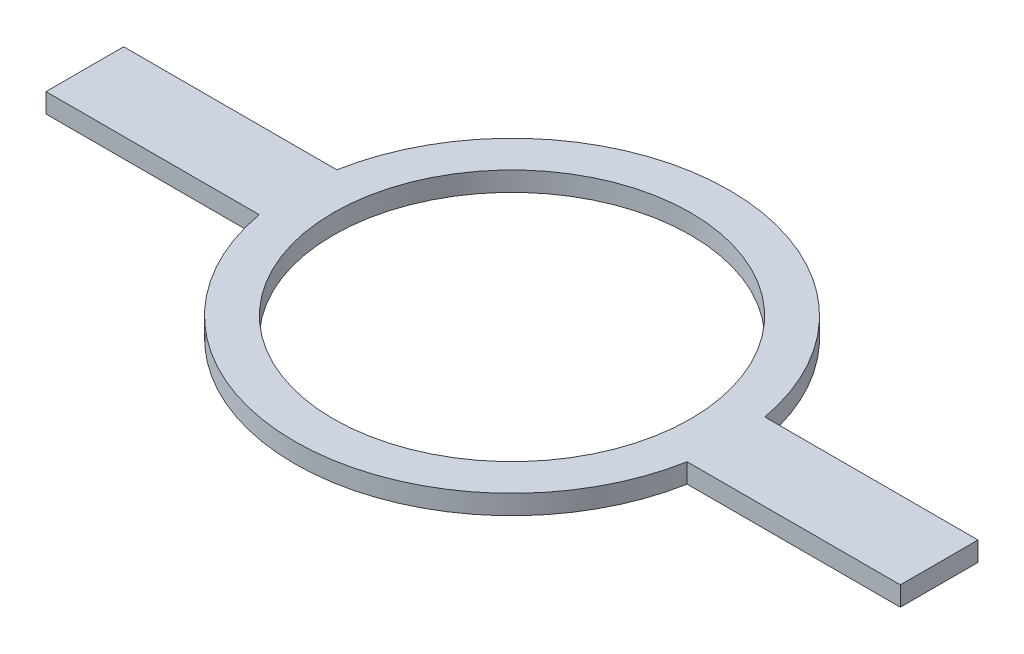
ISO-10303-21;
HEADER;
FILE_DESCRIPTION(('STEP AP214'),'2;1');
FILE_NAME('part.step','',(''),(''),'','','');
FILE_SCHEMA(('AUTOMOTIVE_DESIGN { 1 0 10303 214 1 1 1 1 }'));
ENDSEC;
DATA;
#1=APPLICATION_CONTEXT('core data for automotive mechanical design processes');
#2=APPLICATION_PROTOCOL_DEFINITION('international standard','automotive_design',2000,#1);
#3=PRODUCT_CONTEXT('',#1,'mechanical');
#4=PRODUCT('Part','Part','',(#3));
#5=PRODUCT_RELATED_PRODUCT_CATEGORY('part','',(#4));
#6=PRODUCT_DEFINITION_FORMATION('','',#4);
#7=PRODUCT_DEFINITION_CONTEXT('part definition',#1,'design');
#8=PRODUCT_DEFINITION('design','',#6,#7);
#9=PRODUCT_DEFINITION_SHAPE('','',#8);
#10=(LENGTH_UNIT() NAMED_UNIT(*) SI_UNIT(.MILLI.,.METRE.));
#11=(NAMED_UNIT(*) PLANE_ANGLE_UNIT() SI_UNIT($,.RADIAN.));
#12=(NAMED_UNIT(*) SI_UNIT($,.STERADIAN.) SOLID_ANGLE_UNIT());
#13=UNCERTAINTY_MEASURE_WITH_UNIT(LENGTH_MEASURE(1.E-05),#10,'distance_accuracy_value','');
#14=(GEOMETRIC_REPRESENTATION_CONTEXT(3) GLOBAL_UNCERTAINTY_ASSIGNED_CONTEXT((#13)) GLOBAL_UNIT_ASSIGNED_CONTEXT((#10,
#11,#12)) REPRESENTATION_CONTEXT('',''));
#15=CARTESIAN_POINT('',(0.,0.,0.));
#16=DIRECTION('',(0.,0.,1.));
#17=DIRECTION('',(1.,0.,0.));
#18=AXIS2_PLACEMENT_3D('',#15,#16,#17);
#19=CARTESIAN_POINT('',(0.,6.35,0.));
#20=DIRECTION('',(0.,1.,0.));
#21=DIRECTION('',(0.,0.,1.));
#22=AXIS2_PLACEMENT_3D('',#19,#20,#21);
#23=PLANE('',#22);
#24=DIRECTION('',(1.,0.,0.));
#25=VECTOR('',#24,1.);
#26=CARTESIAN_POINT('',(69.976884754896,6.35,12.7));
#27=LINE('',#26,#25);
#28=CARTESIAN_POINT('',(69.976884754896,6.35,12.7));
#29=VERTEX_POINT('',#28);
#30=CARTESIAN_POINT('',(139.7,6.35,12.7));
#31=VERTEX_POINT('',#30);
#32=EDGE_CURVE('E143',#29,#31,#27,.T.);
#33=ORIENTED_EDGE('',*,*,#32,.T.);
#34=DIRECTION('',(0.,0.,-1.));
#35=VECTOR('',#34,1.);
#36=CARTESIAN_POINT('',(139.7,6.35,-12.7));
#37=LINE('',#36,#35);
#38=CARTESIAN_POINT('',(139.7,6.35,-12.7));
#39=VERTEX_POINT('',#38);
#40=EDGE_CURVE('E91',#31,#39,#37,.T.);
#41=ORIENTED_EDGE('',*,*,#40,.T.);
#42=DIRECTION('',(-1.,0.,0.));
#43=VECTOR('',#42,1.);
#44=CARTESIAN_POINT('',(69.976884754896,6.35,-12.7));
#45=LINE('',#44,#43);
#46=CARTESIAN_POINT('',(69.976884754896,6.35,-12.7));
#47=VERTEX_POINT('',#46);
#48=EDGE_CURVE('E158',#39,#47,#45,.T.);
#49=ORIENTED_EDGE('',*,*,#48,.T.);
#50=CARTESIAN_POINT('',(0.,6.35,0.));
#51=DIRECTION('',(0.,1.,0.));
#52=DIRECTION('',(0.,0.,1.));
#53=AXIS2_PLACEMENT_3D('',#50,#51,#52);
#54=CIRCLE('',#53,71.12);
#55=CARTESIAN_POINT('',(-69.976884754896,6.35,-12.7));
#56=VERTEX_POINT('',#55);
#57=EDGE_CURVE('E171',#47,#56,#54,.T.);
#58=ORIENTED_EDGE('',*,*,#57,.T.);
#59=DIRECTION('',(-1.,0.,0.));
#60=VECTOR('',#59,1.);
#61=CARTESIAN_POINT('',(-139.7,6.35,-12.7));
#62=LINE('',#61,#60);
#63=CARTESIAN_POINT('',(-139.7,6.35,-12.7));
#64=VERTEX_POINT('',#63);
#65=EDGE_CURVE('E110',#56,#64,#62,.T.);
#66=ORIENTED_EDGE('',*,*,#65,.T.);
#67=DIRECTION('',(0.,0.,1.));
#68=VECTOR('',#67,1.);
#69=CARTESIAN_POINT('',(-139.7,6.35,-12.7));
#70=LINE('',#69,#68);
#71=CARTESIAN_POINT('',(-139.7,6.35,12.7));
#72=VERTEX_POINT('',#71);
#73=EDGE_CURVE('E104',#64,#72,#70,.T.);
#74=ORIENTED_EDGE('',*,*,#73,.T.);
#75=DIRECTION('',(1.,0.,0.));
#76=VECTOR('',#75,1.);
#77=CARTESIAN_POINT('',(-139.7,6.35,12.7));
#78=LINE('',#77,#76);
#79=CARTESIAN_POINT('',(-69.976884754896,6.35,12.7));
#80=VERTEX_POINT('',#79);
#81=EDGE_CURVE('E108',#72,#80,#78,.T.);
#82=ORIENTED_EDGE('',*,*,#81,.T.);
#83=CARTESIAN_POINT('',(0.,6.35,0.));
#84=DIRECTION('',(0.,1.,0.));
#85=DIRECTION('',(0.,0.,1.));
#86=AXIS2_PLACEMENT_3D('',#83,#84,#85);
#87=CIRCLE('',#86,71.12);
#88=EDGE_CURVE('E48',#80,#29,#87,.T.);
#89=ORIENTED_EDGE('',*,*,#88,.T.);
#90=EDGE_LOOP('',(#33,#41,#49,#58,#66,#74,#82,#89));
#91=FACE_BOUND('',#90,.T.);
#92=CARTESIAN_POINT('',(0.,6.35,0.));
#93=DIRECTION('',(0.,1.,0.));
#94=DIRECTION('',(0.,0.,1.));
#95=AXIS2_PLACEMENT_3D('',#92,#93,#94);
#96=CIRCLE('',#95,58.42);
#97=CARTESIAN_POINT('',(0.,6.35,58.42));
#98=VERTEX_POINT('',#97);
#99=EDGE_CURVE('E132',#98,#98,#96,.T.);
#100=ORIENTED_EDGE('',*,*,#99,.F.);
#101=EDGE_LOOP('',(#100));
#102=FACE_BOUND('',#101,.T.);
#103=ADVANCED_FACE('F31',(#91,#102),#23,.T.);
#104=CARTESIAN_POINT('',(0.,0.,0.));
#105=DIRECTION('',(0.,1.,0.));
#106=DIRECTION('',(0.,0.,1.));
#107=AXIS2_PLACEMENT_3D('',#104,#105,#106);
#108=PLANE('',#107);
#109=DIRECTION('',(1.,0.,0.));
#110=VECTOR('',#109,1.);
#111=CARTESIAN_POINT('',(69.976884754896,0.,12.7));
#112=LINE('',#111,#110);
#113=CARTESIAN_POINT('',(69.976884754896,0.,12.7));
#114=VERTEX_POINT('',#113);
#115=CARTESIAN_POINT('',(139.7,0.,12.7));
#116=VERTEX_POINT('',#115);
#117=EDGE_CURVE('E128',#114,#116,#112,.T.);
#118=ORIENTED_EDGE('',*,*,#117,.F.);
#119=CARTESIAN_POINT('',(0.,0.,0.));
#120=DIRECTION('',(0.,1.,0.));
#121=DIRECTION('',(0.,0.,1.));
#122=AXIS2_PLACEMENT_3D('',#119,#120,#121);
#123=CIRCLE('',#122,71.12);
#124=CARTESIAN_POINT('',(-69.976884754896,0.,12.7));
#125=VERTEX_POINT('',#124);
#126=EDGE_CURVE('E83',#125,#114,#123,.T.);
#127=ORIENTED_EDGE('',*,*,#126,.F.);
#128=DIRECTION('',(1.,0.,0.));
#129=VECTOR('',#128,1.);
#130=CARTESIAN_POINT('',(-139.7,0.,12.7));
#131=LINE('',#130,#129);
#132=CARTESIAN_POINT('',(-139.7,0.,12.7));
#133=VERTEX_POINT('',#132);
#134=EDGE_CURVE('E77',#133,#125,#131,.T.);
#135=ORIENTED_EDGE('',*,*,#134,.F.);
#136=DIRECTION('',(0.,0.,1.));
#137=VECTOR('',#136,1.);
#138=CARTESIAN_POINT('',(-139.7,0.,-12.7));
#139=LINE('',#138,#137);
#140=CARTESIAN_POINT('',(-139.7,0.,-12.7));
#141=VERTEX_POINT('',#140);
#142=EDGE_CURVE('E118',#141,#133,#139,.T.);
#143=ORIENTED_EDGE('',*,*,#142,.F.);
#144=DIRECTION('',(-1.,0.,0.));
#145=VECTOR('',#144,1.);
#146=CARTESIAN_POINT('',(-139.7,0.,-12.7));
#147=LINE('',#146,#145);
#148=CARTESIAN_POINT('',(-69.976884754896,0.,-12.7));
#149=VERTEX_POINT('',#148);
#150=EDGE_CURVE('E138',#149,#141,#147,.T.);
#151=ORIENTED_EDGE('',*,*,#150,.F.);
#152=CARTESIAN_POINT('',(0.,0.,0.));
#153=DIRECTION('',(0.,1.,0.));
#154=DIRECTION('',(0.,0.,1.));
#155=AXIS2_PLACEMENT_3D('',#152,#153,#154);
#156=CIRCLE('',#155,71.12);
#157=CARTESIAN_POINT('',(69.976884754896,0.,-12.7));
#158=VERTEX_POINT('',#157);
#159=EDGE_CURVE('E136',#158,#149,#156,.T.);
#160=ORIENTED_EDGE('',*,*,#159,.F.);
#161=DIRECTION('',(-1.,0.,0.));
#162=VECTOR('',#161,1.);
#163=CARTESIAN_POINT('',(69.976884754896,0.,-12.7));
#164=LINE('',#163,#162);
#165=CARTESIAN_POINT('',(139.7,0.,-12.7));
#166=VERTEX_POINT('',#165);
#167=EDGE_CURVE('E134',#166,#158,#164,.T.);
#168=ORIENTED_EDGE('',*,*,#167,.F.);
#169=DIRECTION('',(0.,0.,-1.));
#170=VECTOR('',#169,1.);
#171=CARTESIAN_POINT('',(139.7,0.,-12.7));
#172=LINE('',#171,#170);
#173=EDGE_CURVE('E131',#116,#166,#172,.T.);
#174=ORIENTED_EDGE('',*,*,#173,.F.);
#175=EDGE_LOOP('',(#118,#127,#135,#143,#151,#160,#168,#174));
#176=FACE_BOUND('',#175,.T.);
#177=CARTESIAN_POINT('',(0.,0.,0.));
#178=DIRECTION('',(0.,1.,0.));
#179=DIRECTION('',(0.,0.,1.));
#180=AXIS2_PLACEMENT_3D('',#177,#178,#179);
#181=CIRCLE('',#180,58.42);
#182=CARTESIAN_POINT('',(0.,0.,58.42));
#183=VERTEX_POINT('',#182);
#184=EDGE_CURVE('E177',#183,#183,#181,.T.);
#185=ORIENTED_EDGE('',*,*,#184,.T.);
#186=EDGE_LOOP('',(#185));
#187=FACE_BOUND('',#186,.T.);
#188=ADVANCED_FACE('F162',(#176,#187),#108,.F.);
#189=CARTESIAN_POINT('',(69.976884754896,6.35,12.7));
#190=DIRECTION('',(0.,0.,-1.));
#191=DIRECTION('',(-1.,0.,0.));
#192=AXIS2_PLACEMENT_3D('',#189,#190,#191);
#193=PLANE('',#192);
#194=ORIENTED_EDGE('',*,*,#117,.T.);
#195=DIRECTION('',(0.,-1.,0.));
#196=VECTOR('',#195,1.);
#197=CARTESIAN_POINT('',(139.7,6.35,12.7));
#198=LINE('',#197,#196);
#199=EDGE_CURVE('E11',#31,#116,#198,.T.);
#200=ORIENTED_EDGE('',*,*,#199,.F.);
#201=ORIENTED_EDGE('',*,*,#32,.F.);
#202=DIRECTION('',(0.,-1.,0.));
#203=VECTOR('',#202,1.);
#204=CARTESIAN_POINT('',(69.976884754896,6.35,12.7));
#205=LINE('',#204,#203);
#206=EDGE_CURVE('E124',#29,#114,#205,.T.);
#207=ORIENTED_EDGE('',*,*,#206,.T.);
#208=EDGE_LOOP('',(#194,#200,#201,#207));
#209=FACE_BOUND('',#208,.T.);
#210=ADVANCED_FACE('F33',(#209),#193,.F.);
#211=CARTESIAN_POINT('',(139.7,6.35,-12.7));
#212=DIRECTION('',(-1.,0.,0.));
#213=DIRECTION('',(0.,0.,1.));
#214=AXIS2_PLACEMENT_3D('',#211,#212,#213);
#215=PLANE('',#214);
#216=ORIENTED_EDGE('',*,*,#173,.T.);
#217=DIRECTION('',(0.,-1.,0.));
#218=VECTOR('',#217,1.);
#219=CARTESIAN_POINT('',(139.7,6.35,-12.7));
#220=LINE('',#219,#218);
#221=EDGE_CURVE('E40',#39,#166,#220,.T.);
#222=ORIENTED_EDGE('',*,*,#221,.F.);
#223=ORIENTED_EDGE('',*,*,#40,.F.);
#224=ORIENTED_EDGE('',*,*,#199,.T.);
#225=EDGE_LOOP('',(#216,#222,#223,#224));
#226=FACE_BOUND('',#225,.T.);
#227=ADVANCED_FACE('F205',(#226),#215,.F.);
#228=CARTESIAN_POINT('',(69.976884754896,6.35,-12.7));
#229=DIRECTION('',(0.,0.,1.));
#230=DIRECTION('',(1.,0.,0.));
#231=AXIS2_PLACEMENT_3D('',#228,#229,#230);
#232=PLANE('',#231);
#233=ORIENTED_EDGE('',*,*,#167,.T.);
#234=DIRECTION('',(0.,-1.,0.));
#235=VECTOR('',#234,1.);
#236=CARTESIAN_POINT('',(69.976884754896,6.35,-12.7));
#237=LINE('',#236,#235);
#238=EDGE_CURVE('E150',#47,#158,#237,.T.);
#239=ORIENTED_EDGE('',*,*,#238,.F.);
#240=ORIENTED_EDGE('',*,*,#48,.F.);
#241=ORIENTED_EDGE('',*,*,#221,.T.);
#242=EDGE_LOOP('',(#233,#239,#240,#241));
#243=FACE_BOUND('',#242,.T.);
#244=ADVANCED_FACE('F156',(#243),#232,.F.);
#245=CARTESIAN_POINT('',(0.,6.35,0.));
#246=DIRECTION('',(0.,-1.,0.));
#247=DIRECTION('',(0.,0.,-1.));
#248=AXIS2_PLACEMENT_3D('',#245,#246,#247);
#249=CYLINDRICAL_SURFACE('',#248,71.12);
#250=ORIENTED_EDGE('',*,*,#159,.T.);
#251=DIRECTION('',(0.,-1.,0.));
#252=VECTOR('',#251,1.);
#253=CARTESIAN_POINT('',(-69.976884754896,6.35,-12.7));
#254=LINE('',#253,#252);
#255=EDGE_CURVE('E147',#56,#149,#254,.T.);
#256=ORIENTED_EDGE('',*,*,#255,.F.);
#257=ORIENTED_EDGE('',*,*,#57,.F.);
#258=ORIENTED_EDGE('',*,*,#238,.T.);
#259=EDGE_LOOP('',(#250,#256,#257,#258));
#260=FACE_BOUND('',#259,.T.);
#261=ADVANCED_FACE('F167',(#260),#249,.T.);
#262=CARTESIAN_POINT('',(-139.7,6.35,-12.7));
#263=DIRECTION('',(0.,0.,1.));
#264=DIRECTION('',(1.,0.,0.));
#265=AXIS2_PLACEMENT_3D('',#262,#263,#264);
#266=PLANE('',#265);
#267=ORIENTED_EDGE('',*,*,#150,.T.);
#268=DIRECTION('',(0.,-1.,0.));
#269=VECTOR('',#268,1.);
#270=CARTESIAN_POINT('',(-139.7,6.35,-12.7));
#271=LINE('',#270,#269);
#272=EDGE_CURVE('E119',#64,#141,#271,.T.);
#273=ORIENTED_EDGE('',*,*,#272,.F.);
#274=ORIENTED_EDGE('',*,*,#65,.F.);
#275=ORIENTED_EDGE('',*,*,#255,.T.);
#276=EDGE_LOOP('',(#267,#273,#274,#275));
#277=FACE_BOUND('',#276,.T.);
#278=ADVANCED_FACE('F170',(#277),#266,.F.);
#279=CARTESIAN_POINT('',(-139.7,6.35,-12.7));
#280=DIRECTION('',(1.,0.,0.));
#281=DIRECTION('',(0.,0.,-1.));
#282=AXIS2_PLACEMENT_3D('',#279,#280,#281);
#283=PLANE('',#282);
#284=ORIENTED_EDGE('',*,*,#142,.T.);
#285=DIRECTION('',(0.,-1.,0.));
#286=VECTOR('',#285,1.);
#287=CARTESIAN_POINT('',(-139.7,6.35,12.7));
#288=LINE('',#287,#286);
#289=EDGE_CURVE('E115',#72,#133,#288,.T.);
#290=ORIENTED_EDGE('',*,*,#289,.F.);
#291=ORIENTED_EDGE('',*,*,#73,.F.);
#292=ORIENTED_EDGE('',*,*,#272,.T.);
#293=EDGE_LOOP('',(#284,#290,#291,#292));
#294=FACE_BOUND('',#293,.T.);
#295=ADVANCED_FACE('F116',(#294),#283,.F.);
#296=CARTESIAN_POINT('',(-139.7,6.35,12.7));
#297=DIRECTION('',(0.,0.,-1.));
#298=DIRECTION('',(-1.,0.,0.));
#299=AXIS2_PLACEMENT_3D('',#296,#297,#298);
#300=PLANE('',#299);
#301=ORIENTED_EDGE('',*,*,#134,.T.);
#302=DIRECTION('',(0.,-1.,0.));
#303=VECTOR('',#302,1.);
#304=CARTESIAN_POINT('',(-69.976884754896,6.35,12.7));
#305=LINE('',#304,#303);
#306=EDGE_CURVE('E120',#80,#125,#305,.T.);
#307=ORIENTED_EDGE('',*,*,#306,.F.);
#308=ORIENTED_EDGE('',*,*,#81,.F.);
#309=ORIENTED_EDGE('',*,*,#289,.T.);
#310=EDGE_LOOP('',(#301,#307,#308,#309));
#311=FACE_BOUND('',#310,.T.);
#312=ADVANCED_FACE('F122',(#311),#300,.F.);
#313=CARTESIAN_POINT('',(0.,6.35,0.));
#314=DIRECTION('',(0.,-1.,0.));
#315=DIRECTION('',(0.,0.,-1.));
#316=AXIS2_PLACEMENT_3D('',#313,#314,#315);
#317=CYLINDRICAL_SURFACE('',#316,71.12);
#318=ORIENTED_EDGE('',*,*,#126,.T.);
#319=ORIENTED_EDGE('',*,*,#206,.F.);
#320=ORIENTED_EDGE('',*,*,#88,.F.);
#321=ORIENTED_EDGE('',*,*,#306,.T.);
#322=EDGE_LOOP('',(#318,#319,#320,#321));
#323=FACE_BOUND('',#322,.T.);
#324=ADVANCED_FACE('F193',(#323),#317,.T.);
#325=CARTESIAN_POINT('',(0.,6.35,0.));
#326=DIRECTION('',(0.,-1.,0.));
#327=DIRECTION('',(0.,0.,-1.));
#328=AXIS2_PLACEMENT_3D('',#325,#326,#327);
#329=CYLINDRICAL_SURFACE('',#328,58.42);
#330=ORIENTED_EDGE('',*,*,#99,.T.);
#331=EDGE_LOOP('',(#330));
#332=FACE_BOUND('',#331,.T.);
#333=ORIENTED_EDGE('',*,*,#184,.F.);
#334=EDGE_LOOP('',(#333));
#335=FACE_BOUND('',#334,.T.);
#336=ADVANCED_FACE('F183',(#332,#335),#329,.F.);
#337=CLOSED_SHELL('',(#103,#188,#210,#227,#244,#261,#278,#295,#312,#324,#336));
#338=MANIFOLD_SOLID_BREP('B2',#337);
#339=ADVANCED_BREP_SHAPE_REPRESENTATION('',(#18,#338),#14);
#340=SHAPE_DEFINITION_REPRESENTATION(#9,#339);
ENDSEC;
END-ISO-10303-21;
